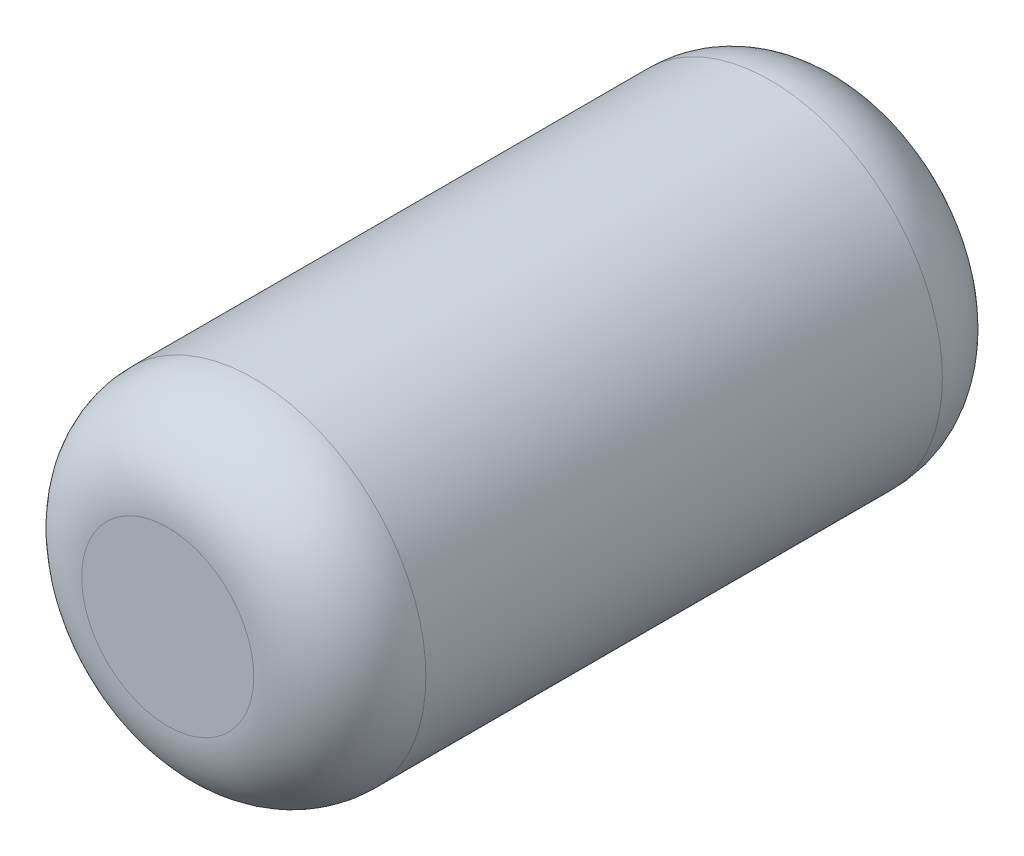
ISO-10303-21;
HEADER;
FILE_DESCRIPTION(('STEP AP214'),'2;1');
FILE_NAME('part.step','',(''),(''),'','','');
FILE_SCHEMA(('AUTOMOTIVE_DESIGN { 1 0 10303 214 1 1 1 1 }'));
ENDSEC;
DATA;
#1=APPLICATION_CONTEXT('core data for automotive mechanical design processes');
#2=APPLICATION_PROTOCOL_DEFINITION('international standard','automotive_design',2000,#1);
#3=PRODUCT_CONTEXT('',#1,'mechanical');
#4=PRODUCT('Part','Part','',(#3));
#5=PRODUCT_RELATED_PRODUCT_CATEGORY('part','',(#4));
#6=PRODUCT_DEFINITION_FORMATION('','',#4);
#7=PRODUCT_DEFINITION_CONTEXT('part definition',#1,'design');
#8=PRODUCT_DEFINITION('design','',#6,#7);
#9=PRODUCT_DEFINITION_SHAPE('','',#8);
#10=(LENGTH_UNIT() NAMED_UNIT(*) SI_UNIT(.MILLI.,.METRE.));
#11=(NAMED_UNIT(*) PLANE_ANGLE_UNIT() SI_UNIT($,.RADIAN.));
#12=(NAMED_UNIT(*) SI_UNIT($,.STERADIAN.) SOLID_ANGLE_UNIT());
#13=UNCERTAINTY_MEASURE_WITH_UNIT(LENGTH_MEASURE(1.E-05),#10,'distance_accuracy_value','');
#14=(GEOMETRIC_REPRESENTATION_CONTEXT(3) GLOBAL_UNCERTAINTY_ASSIGNED_CONTEXT((#13)) GLOBAL_UNIT_ASSIGNED_CONTEXT((#10,
#11,#12)) REPRESENTATION_CONTEXT('',''));
#15=CARTESIAN_POINT('',(0.,0.,0.));
#16=DIRECTION('',(0.,0.,1.));
#17=DIRECTION('',(1.,0.,0.));
#18=AXIS2_PLACEMENT_3D('',#15,#16,#17);
#19=CARTESIAN_POINT('',(0.,0.,100.));
#20=DIRECTION('',(0.,0.,-1.));
#21=DIRECTION('',(-1.,0.,0.));
#22=AXIS2_PLACEMENT_3D('',#19,#20,#21);
#23=CYLINDRICAL_SURFACE('',#22,50.);
#24=CARTESIAN_POINT('',(0.,0.,-75.));
#25=DIRECTION('',(0.,0.,1.));
#26=DIRECTION('',(1.,0.,0.));
#27=AXIS2_PLACEMENT_3D('',#24,#25,#26);
#28=CIRCLE('',#27,50.);
#29=CARTESIAN_POINT('',(50.,0.,-75.));
#30=VERTEX_POINT('',#29);
#31=EDGE_CURVE('E50',#30,#30,#28,.T.);
#32=ORIENTED_EDGE('',*,*,#31,.T.);
#33=EDGE_LOOP('',(#32));
#34=FACE_BOUND('',#33,.T.);
#35=CARTESIAN_POINT('',(0.,0.,75.));
#36=DIRECTION('',(0.,0.,1.));
#37=DIRECTION('',(1.,0.,0.));
#38=AXIS2_PLACEMENT_3D('',#35,#36,#37);
#39=CIRCLE('',#38,50.);
#40=CARTESIAN_POINT('',(50.,0.,75.));
#41=VERTEX_POINT('',#40);
#42=EDGE_CURVE('E55',#41,#41,#39,.F.);
#43=ORIENTED_EDGE('',*,*,#42,.T.);
#44=EDGE_LOOP('',(#43));
#45=FACE_BOUND('',#44,.T.);
#46=ADVANCED_FACE('F37',(#34,#45),#23,.T.);
#47=CARTESIAN_POINT('',(0.,0.,100.));
#48=DIRECTION('',(0.,0.,1.));
#49=DIRECTION('',(1.,0.,0.));
#50=AXIS2_PLACEMENT_3D('',#47,#48,#49);
#51=PLANE('',#50);
#52=CARTESIAN_POINT('',(0.,0.,100.));
#53=DIRECTION('',(0.,0.,1.));
#54=DIRECTION('',(1.,0.,0.));
#55=AXIS2_PLACEMENT_3D('',#52,#53,#54);
#56=CIRCLE('',#55,25.);
#57=CARTESIAN_POINT('',(25.,0.,100.));
#58=VERTEX_POINT('',#57);
#59=EDGE_CURVE('E10',#58,#58,#56,.T.);
#60=ORIENTED_EDGE('',*,*,#59,.T.);
#61=EDGE_LOOP('',(#60));
#62=FACE_BOUND('',#61,.T.);
#63=ADVANCED_FACE('F72',(#62),#51,.T.);
#64=CARTESIAN_POINT('',(0.,0.,-100.));
#65=DIRECTION('',(0.,0.,1.));
#66=DIRECTION('',(1.,0.,0.));
#67=AXIS2_PLACEMENT_3D('',#64,#65,#66);
#68=PLANE('',#67);
#69=CARTESIAN_POINT('',(0.,0.,-100.));
#70=DIRECTION('',(0.,0.,1.));
#71=DIRECTION('',(1.,0.,0.));
#72=AXIS2_PLACEMENT_3D('',#69,#70,#71);
#73=CIRCLE('',#72,25.);
#74=CARTESIAN_POINT('',(25.,0.,-100.));
#75=VERTEX_POINT('',#74);
#76=EDGE_CURVE('E45',#75,#75,#73,.F.);
#77=ORIENTED_EDGE('',*,*,#76,.T.);
#78=EDGE_LOOP('',(#77));
#79=FACE_BOUND('',#78,.T.);
#80=ADVANCED_FACE('F69',(#79),#68,.F.);
#81=CARTESIAN_POINT('',(0.,0.,-75.));
#82=DIRECTION('',(0.,0.,1.));
#83=DIRECTION('',(1.,0.,0.));
#84=AXIS2_PLACEMENT_3D('',#81,#82,#83);
#85=DEGENERATE_TOROIDAL_SURFACE('',#84,25.,25.,.T.);
#86=ORIENTED_EDGE('',*,*,#76,.F.);
#87=EDGE_LOOP('',(#86));
#88=FACE_BOUND('',#87,.T.);
#89=ORIENTED_EDGE('',*,*,#31,.F.);
#90=EDGE_LOOP('',(#89));
#91=FACE_BOUND('',#90,.T.);
#92=ADVANCED_FACE('F65',(#88,#91),#85,.T.);
#93=CARTESIAN_POINT('',(0.,0.,75.));
#94=DIRECTION('',(0.,0.,1.));
#95=DIRECTION('',(1.,0.,0.));
#96=AXIS2_PLACEMENT_3D('',#93,#94,#95);
#97=DEGENERATE_TOROIDAL_SURFACE('',#96,25.,25.,.T.);
#98=ORIENTED_EDGE('',*,*,#42,.F.);
#99=EDGE_LOOP('',(#98));
#100=FACE_BOUND('',#99,.T.);
#101=ORIENTED_EDGE('',*,*,#59,.F.);
#102=EDGE_LOOP('',(#101));
#103=FACE_BOUND('',#102,.T.);
#104=ADVANCED_FACE('F39',(#100,#103),#97,.T.);
#105=CLOSED_SHELL('',(#46,#63,#80,#92,#104));
#106=MANIFOLD_SOLID_BREP('B2',#105);
#107=ADVANCED_BREP_SHAPE_REPRESENTATION('',(#18,#106),#14);
#108=SHAPE_DEFINITION_REPRESENTATION(#9,#107);
ENDSEC;
END-ISO-10303-21;
